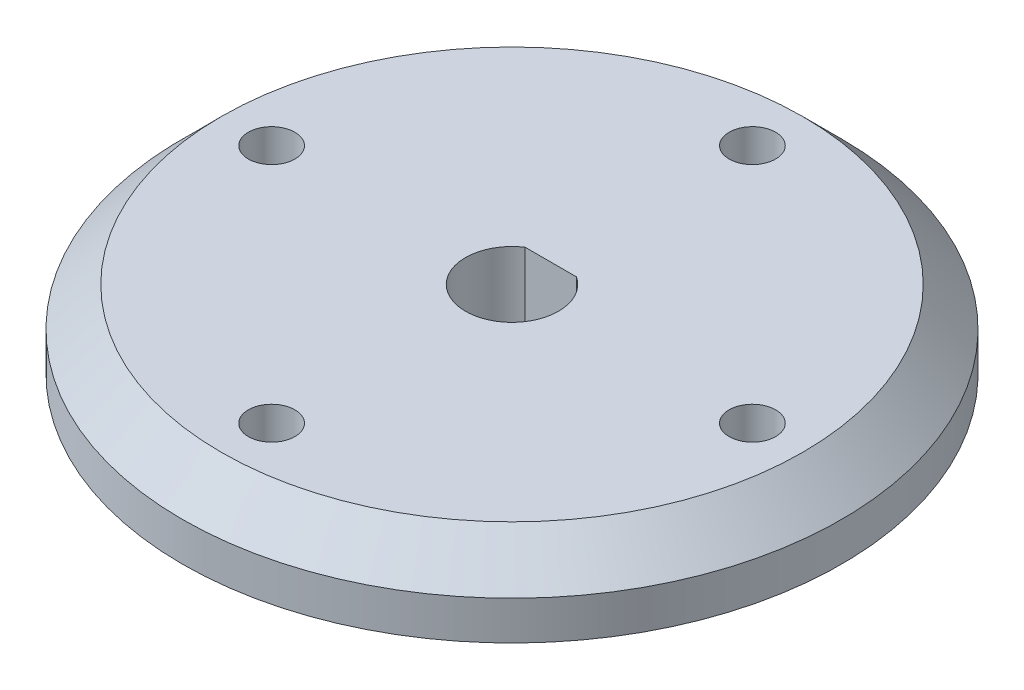
ISO-10303-21;
HEADER;
FILE_DESCRIPTION(('STEP AP214'),'2;1');
FILE_NAME('part.step','',(''),(''),'','','');
FILE_SCHEMA(('AUTOMOTIVE_DESIGN { 1 0 10303 214 1 1 1 1 }'));
ENDSEC;
DATA;
#1=APPLICATION_CONTEXT('core data for automotive mechanical design processes');
#2=APPLICATION_PROTOCOL_DEFINITION('international standard','automotive_design',2000,#1);
#3=PRODUCT_CONTEXT('',#1,'mechanical');
#4=PRODUCT('Part','Part','',(#3));
#5=PRODUCT_RELATED_PRODUCT_CATEGORY('part','',(#4));
#6=PRODUCT_DEFINITION_FORMATION('','',#4);
#7=PRODUCT_DEFINITION_CONTEXT('part definition',#1,'design');
#8=PRODUCT_DEFINITION('design','',#6,#7);
#9=PRODUCT_DEFINITION_SHAPE('','',#8);
#10=(LENGTH_UNIT() NAMED_UNIT(*) SI_UNIT(.MILLI.,.METRE.));
#11=(NAMED_UNIT(*) PLANE_ANGLE_UNIT() SI_UNIT($,.RADIAN.));
#12=(NAMED_UNIT(*) SI_UNIT($,.STERADIAN.) SOLID_ANGLE_UNIT());
#13=UNCERTAINTY_MEASURE_WITH_UNIT(LENGTH_MEASURE(1.E-05),#10,'distance_accuracy_value','');
#14=(GEOMETRIC_REPRESENTATION_CONTEXT(3) GLOBAL_UNCERTAINTY_ASSIGNED_CONTEXT((#13)) GLOBAL_UNIT_ASSIGNED_CONTEXT((#10,
#11,#12)) REPRESENTATION_CONTEXT('',''));
#15=CARTESIAN_POINT('',(0.,0.,0.));
#16=DIRECTION('',(0.,0.,1.));
#17=DIRECTION('',(1.,0.,0.));
#18=AXIS2_PLACEMENT_3D('',#15,#16,#17);
#19=CARTESIAN_POINT('',(0.,5.,0.));
#20=DIRECTION('',(0.,1.,0.));
#21=DIRECTION('',(0.,0.,1.));
#22=AXIS2_PLACEMENT_3D('',#19,#20,#21);
#23=PLANE('',#22);
#24=CARTESIAN_POINT('',(0.,5.,0.));
#25=DIRECTION('',(0.,1.,0.));
#26=DIRECTION('',(0.,0.,1.));
#27=AXIS2_PLACEMENT_3D('',#24,#25,#26);
#28=CIRCLE('',#27,18.75);
#29=CARTESIAN_POINT('',(0.,5.,-18.75));
#30=VERTEX_POINT('',#29);
#31=EDGE_CURVE('E54',#30,#30,#28,.T.);
#32=ORIENTED_EDGE('',*,*,#31,.T.);
#33=EDGE_LOOP('',(#32));
#34=FACE_BOUND('',#33,.T.);
#35=CARTESIAN_POINT('',(0.,5.,15.5));
#36=DIRECTION('',(0.,1.,0.));
#37=DIRECTION('',(0.,0.,1.));
#38=AXIS2_PLACEMENT_3D('',#35,#36,#37);
#39=CIRCLE('',#38,1.5);
#40=CARTESIAN_POINT('',(0.,5.,17.));
#41=VERTEX_POINT('',#40);
#42=EDGE_CURVE('E151',#41,#41,#39,.T.);
#43=ORIENTED_EDGE('',*,*,#42,.F.);
#44=EDGE_LOOP('',(#43));
#45=FACE_BOUND('',#44,.T.);
#46=CARTESIAN_POINT('',(0.,5.,-15.5));
#47=DIRECTION('',(0.,1.,0.));
#48=DIRECTION('',(0.,0.,1.));
#49=AXIS2_PLACEMENT_3D('',#46,#47,#48);
#50=CIRCLE('',#49,1.5);
#51=CARTESIAN_POINT('',(0.,5.,-14.));
#52=VERTEX_POINT('',#51);
#53=EDGE_CURVE('E87',#52,#52,#50,.T.);
#54=ORIENTED_EDGE('',*,*,#53,.F.);
#55=EDGE_LOOP('',(#54));
#56=FACE_BOUND('',#55,.T.);
#57=DIRECTION('',(-1.,0.,0.));
#58=VECTOR('',#57,1.);
#59=CARTESIAN_POINT('',(-1.6583123951777,5.,-2.5));
#60=LINE('',#59,#58);
#61=CARTESIAN_POINT('',(1.6583123951777,5.,-2.5));
#62=VERTEX_POINT('',#61);
#63=CARTESIAN_POINT('',(-1.6583123951777,5.,-2.5));
#64=VERTEX_POINT('',#63);
#65=EDGE_CURVE('E93',#62,#64,#60,.T.);
#66=ORIENTED_EDGE('',*,*,#65,.F.);
#67=CARTESIAN_POINT('',(0.,5.,0.));
#68=DIRECTION('',(0.,1.,0.));
#69=DIRECTION('',(0.,0.,1.));
#70=AXIS2_PLACEMENT_3D('',#67,#68,#69);
#71=CIRCLE('',#70,3.);
#72=EDGE_CURVE('E78',#64,#62,#71,.T.);
#73=ORIENTED_EDGE('',*,*,#72,.F.);
#74=EDGE_LOOP('',(#66,#73));
#75=FACE_BOUND('',#74,.T.);
#76=CARTESIAN_POINT('',(15.5,5.,0.));
#77=DIRECTION('',(0.,1.,0.));
#78=DIRECTION('',(0.,0.,1.));
#79=AXIS2_PLACEMENT_3D('',#76,#77,#78);
#80=CIRCLE('',#79,1.5);
#81=CARTESIAN_POINT('',(15.5,5.,1.5));
#82=VERTEX_POINT('',#81);
#83=EDGE_CURVE('E165',#82,#82,#80,.T.);
#84=ORIENTED_EDGE('',*,*,#83,.F.);
#85=EDGE_LOOP('',(#84));
#86=FACE_BOUND('',#85,.T.);
#87=CARTESIAN_POINT('',(-15.5,5.,0.));
#88=DIRECTION('',(0.,1.,0.));
#89=DIRECTION('',(0.,0.,1.));
#90=AXIS2_PLACEMENT_3D('',#87,#88,#89);
#91=CIRCLE('',#90,1.5);
#92=CARTESIAN_POINT('',(-15.5,5.,1.5));
#93=VERTEX_POINT('',#92);
#94=EDGE_CURVE('E156',#93,#93,#91,.T.);
#95=ORIENTED_EDGE('',*,*,#94,.F.);
#96=EDGE_LOOP('',(#95));
#97=FACE_BOUND('',#96,.T.);
#98=ADVANCED_FACE('F45',(#34,#45,#56,#75,#86,#97),#23,.T.);
#99=CARTESIAN_POINT('',(0.,0.,0.));
#100=DIRECTION('',(0.,1.,0.));
#101=DIRECTION('',(0.,0.,1.));
#102=AXIS2_PLACEMENT_3D('',#99,#100,#101);
#103=PLANE('',#102);
#104=CARTESIAN_POINT('',(0.,0.,0.));
#105=DIRECTION('',(0.,1.,0.));
#106=DIRECTION('',(0.,0.,1.));
#107=AXIS2_PLACEMENT_3D('',#104,#105,#106);
#108=CIRCLE('',#107,21.25);
#109=CARTESIAN_POINT('',(0.,0.,21.25));
#110=VERTEX_POINT('',#109);
#111=EDGE_CURVE('E83',#110,#110,#108,.T.);
#112=ORIENTED_EDGE('',*,*,#111,.F.);
#113=EDGE_LOOP('',(#112));
#114=FACE_BOUND('',#113,.T.);
#115=CARTESIAN_POINT('',(0.,0.,0.));
#116=DIRECTION('',(0.,1.,0.));
#117=DIRECTION('',(0.,0.,1.));
#118=AXIS2_PLACEMENT_3D('',#115,#116,#117);
#119=CIRCLE('',#118,3.);
#120=CARTESIAN_POINT('',(-1.6583123951777,0.,-2.5));
#121=VERTEX_POINT('',#120);
#122=CARTESIAN_POINT('',(1.6583123951777,0.,-2.5));
#123=VERTEX_POINT('',#122);
#124=EDGE_CURVE('E68',#121,#123,#119,.T.);
#125=ORIENTED_EDGE('',*,*,#124,.T.);
#126=DIRECTION('',(-1.,0.,0.));
#127=VECTOR('',#126,1.);
#128=CARTESIAN_POINT('',(-1.6583123951777,0.,-2.5));
#129=LINE('',#128,#127);
#130=EDGE_CURVE('E74',#123,#121,#129,.T.);
#131=ORIENTED_EDGE('',*,*,#130,.T.);
#132=EDGE_LOOP('',(#125,#131));
#133=FACE_BOUND('',#132,.T.);
#134=CARTESIAN_POINT('',(0.,0.,-15.5));
#135=DIRECTION('',(0.,1.,0.));
#136=DIRECTION('',(0.,0.,1.));
#137=AXIS2_PLACEMENT_3D('',#134,#135,#136);
#138=CIRCLE('',#137,1.5);
#139=CARTESIAN_POINT('',(0.,0.,-14.));
#140=VERTEX_POINT('',#139);
#141=EDGE_CURVE('E90',#140,#140,#138,.T.);
#142=ORIENTED_EDGE('',*,*,#141,.T.);
#143=EDGE_LOOP('',(#142));
#144=FACE_BOUND('',#143,.T.);
#145=CARTESIAN_POINT('',(15.5,0.,0.));
#146=DIRECTION('',(0.,1.,0.));
#147=DIRECTION('',(0.,0.,1.));
#148=AXIS2_PLACEMENT_3D('',#145,#146,#147);
#149=CIRCLE('',#148,1.5);
#150=CARTESIAN_POINT('',(15.5,0.,1.5));
#151=VERTEX_POINT('',#150);
#152=EDGE_CURVE('E158',#151,#151,#149,.T.);
#153=ORIENTED_EDGE('',*,*,#152,.T.);
#154=EDGE_LOOP('',(#153));
#155=FACE_BOUND('',#154,.T.);
#156=CARTESIAN_POINT('',(0.,0.,15.5));
#157=DIRECTION('',(0.,1.,0.));
#158=DIRECTION('',(0.,0.,1.));
#159=AXIS2_PLACEMENT_3D('',#156,#157,#158);
#160=CIRCLE('',#159,1.5);
#161=CARTESIAN_POINT('',(0.,0.,17.));
#162=VERTEX_POINT('',#161);
#163=EDGE_CURVE('E154',#162,#162,#160,.T.);
#164=ORIENTED_EDGE('',*,*,#163,.T.);
#165=EDGE_LOOP('',(#164));
#166=FACE_BOUND('',#165,.T.);
#167=CARTESIAN_POINT('',(-15.5,0.,0.));
#168=DIRECTION('',(0.,1.,0.));
#169=DIRECTION('',(0.,0.,1.));
#170=AXIS2_PLACEMENT_3D('',#167,#168,#169);
#171=CIRCLE('',#170,1.5);
#172=CARTESIAN_POINT('',(-15.5,0.,1.5));
#173=VERTEX_POINT('',#172);
#174=EDGE_CURVE('E161',#173,#173,#171,.T.);
#175=ORIENTED_EDGE('',*,*,#174,.T.);
#176=EDGE_LOOP('',(#175));
#177=FACE_BOUND('',#176,.T.);
#178=ADVANCED_FACE('F85',(#114,#133,#144,#155,#166,#177),#103,.F.);
#179=CARTESIAN_POINT('',(0.,5.,0.));
#180=DIRECTION('',(0.,-1.,0.));
#181=DIRECTION('',(0.,0.,-1.));
#182=AXIS2_PLACEMENT_3D('',#179,#180,#181);
#183=CYLINDRICAL_SURFACE('',#182,21.25);
#184=CARTESIAN_POINT('',(0.,2.49999999999997,0.));
#185=DIRECTION('',(0.,1.,0.));
#186=DIRECTION('',(0.,0.,1.));
#187=AXIS2_PLACEMENT_3D('',#184,#185,#186);
#188=CIRCLE('',#187,21.25);
#189=CARTESIAN_POINT('',(0.,2.49999999999997,-21.25));
#190=VERTEX_POINT('',#189);
#191=EDGE_CURVE('E11',#190,#190,#188,.F.);
#192=ORIENTED_EDGE('',*,*,#191,.T.);
#193=EDGE_LOOP('',(#192));
#194=FACE_BOUND('',#193,.T.);
#195=ORIENTED_EDGE('',*,*,#111,.T.);
#196=EDGE_LOOP('',(#195));
#197=FACE_BOUND('',#196,.T.);
#198=ADVANCED_FACE('F119',(#194,#197),#183,.T.);
#199=CARTESIAN_POINT('',(0.,5.,0.));
#200=DIRECTION('',(0.,-1.,0.));
#201=DIRECTION('',(0.,0.,-1.));
#202=AXIS2_PLACEMENT_3D('',#199,#200,#201);
#203=CYLINDRICAL_SURFACE('',#202,3.);
#204=ORIENTED_EDGE('',*,*,#124,.F.);
#205=DIRECTION('',(0.,-1.,0.));
#206=VECTOR('',#205,1.);
#207=CARTESIAN_POINT('',(-1.6583123951777,5.,-2.5));
#208=LINE('',#207,#206);
#209=EDGE_CURVE('E76',#64,#121,#208,.T.);
#210=ORIENTED_EDGE('',*,*,#209,.F.);
#211=ORIENTED_EDGE('',*,*,#72,.T.);
#212=DIRECTION('',(0.,-1.,0.));
#213=VECTOR('',#212,1.);
#214=CARTESIAN_POINT('',(1.6583123951777,5.,-2.5));
#215=LINE('',#214,#213);
#216=EDGE_CURVE('E61',#62,#123,#215,.T.);
#217=ORIENTED_EDGE('',*,*,#216,.T.);
#218=EDGE_LOOP('',(#204,#210,#211,#217));
#219=FACE_BOUND('',#218,.T.);
#220=ADVANCED_FACE('F80',(#219),#203,.F.);
#221=CARTESIAN_POINT('',(-1.6583123951777,5.,-2.5));
#222=DIRECTION('',(0.,0.,1.));
#223=DIRECTION('',(1.,0.,0.));
#224=AXIS2_PLACEMENT_3D('',#221,#222,#223);
#225=PLANE('',#224);
#226=ORIENTED_EDGE('',*,*,#130,.F.);
#227=ORIENTED_EDGE('',*,*,#216,.F.);
#228=ORIENTED_EDGE('',*,*,#65,.T.);
#229=ORIENTED_EDGE('',*,*,#209,.T.);
#230=EDGE_LOOP('',(#226,#227,#228,#229));
#231=FACE_BOUND('',#230,.T.);
#232=ADVANCED_FACE('F75',(#231),#225,.T.);
#233=CARTESIAN_POINT('',(0.,5.,-15.5));
#234=DIRECTION('',(0.,-1.,0.));
#235=DIRECTION('',(0.,0.,-1.));
#236=AXIS2_PLACEMENT_3D('',#233,#234,#235);
#237=CYLINDRICAL_SURFACE('',#236,1.5);
#238=ORIENTED_EDGE('',*,*,#53,.T.);
#239=EDGE_LOOP('',(#238));
#240=FACE_BOUND('',#239,.T.);
#241=ORIENTED_EDGE('',*,*,#141,.F.);
#242=EDGE_LOOP('',(#241));
#243=FACE_BOUND('',#242,.T.);
#244=ADVANCED_FACE('F133',(#240,#243),#237,.F.);
#245=CARTESIAN_POINT('',(15.5,5.,0.));
#246=DIRECTION('',(0.,-1.,0.));
#247=DIRECTION('',(0.,0.,-1.));
#248=AXIS2_PLACEMENT_3D('',#245,#246,#247);
#249=CYLINDRICAL_SURFACE('',#248,1.5);
#250=ORIENTED_EDGE('',*,*,#83,.T.);
#251=EDGE_LOOP('',(#250));
#252=FACE_BOUND('',#251,.T.);
#253=ORIENTED_EDGE('',*,*,#152,.F.);
#254=EDGE_LOOP('',(#253));
#255=FACE_BOUND('',#254,.T.);
#256=ADVANCED_FACE('F137',(#252,#255),#249,.F.);
#257=CARTESIAN_POINT('',(0.,5.,15.5));
#258=DIRECTION('',(0.,-1.,0.));
#259=DIRECTION('',(0.,0.,-1.));
#260=AXIS2_PLACEMENT_3D('',#257,#258,#259);
#261=CYLINDRICAL_SURFACE('',#260,1.5);
#262=ORIENTED_EDGE('',*,*,#42,.T.);
#263=EDGE_LOOP('',(#262));
#264=FACE_BOUND('',#263,.T.);
#265=ORIENTED_EDGE('',*,*,#163,.F.);
#266=EDGE_LOOP('',(#265));
#267=FACE_BOUND('',#266,.T.);
#268=ADVANCED_FACE('F110',(#264,#267),#261,.F.);
#269=CARTESIAN_POINT('',(-15.5,5.,0.));
#270=DIRECTION('',(0.,-1.,0.));
#271=DIRECTION('',(0.,0.,-1.));
#272=AXIS2_PLACEMENT_3D('',#269,#270,#271);
#273=CYLINDRICAL_SURFACE('',#272,1.5);
#274=ORIENTED_EDGE('',*,*,#94,.T.);
#275=EDGE_LOOP('',(#274));
#276=FACE_BOUND('',#275,.T.);
#277=ORIENTED_EDGE('',*,*,#174,.F.);
#278=EDGE_LOOP('',(#277));
#279=FACE_BOUND('',#278,.T.);
#280=ADVANCED_FACE('F104',(#276,#279),#273,.F.);
#281=CARTESIAN_POINT('',(0.,5.,0.));
#282=DIRECTION('',(0.,-1.,0.));
#283=DIRECTION('',(0.,0.,-1.));
#284=AXIS2_PLACEMENT_3D('',#281,#282,#283);
#285=CONICAL_SURFACE('',#284,18.75,0.785398163397445);
#286=CARTESIAN_POINT('',(0.,2.49999999999997,-21.25));
#287=CARTESIAN_POINT('',(0.,2.52604166666664,-21.2239583333333));
#288=CARTESIAN_POINT('',(0.,2.55208333333331,-21.1979166666667));
#289=CARTESIAN_POINT('',(0.,2.60416666666664,-21.1458333333333));
#290=CARTESIAN_POINT('',(0.,2.63020833333331,-21.1197916666667));
#291=CARTESIAN_POINT('',(0.,2.68229166666664,-21.0677083333333));
#292=CARTESIAN_POINT('',(0.,2.70833333333331,-21.0416666666667));
#293=CARTESIAN_POINT('',(0.,2.76041666666664,-20.9895833333333));
#294=CARTESIAN_POINT('',(0.,2.78645833333331,-20.9635416666667));
#295=CARTESIAN_POINT('',(0.,2.83854166666664,-20.9114583333333));
#296=CARTESIAN_POINT('',(0.,2.86458333333331,-20.8854166666667));
#297=CARTESIAN_POINT('',(0.,2.91666666666664,-20.8333333333333));
#298=CARTESIAN_POINT('',(0.,2.94270833333331,-20.8072916666667));
#299=CARTESIAN_POINT('',(0.,2.99479166666664,-20.7552083333333));
#300=CARTESIAN_POINT('',(0.,3.02083333333331,-20.7291666666667));
#301=CARTESIAN_POINT('',(0.,3.07291666666665,-20.6770833333333));
#302=CARTESIAN_POINT('',(0.,3.09895833333331,-20.6510416666667));
#303=CARTESIAN_POINT('',(0.,3.15104166666665,-20.5989583333333));
#304=CARTESIAN_POINT('',(0.,3.17708333333331,-20.5729166666667));
#305=CARTESIAN_POINT('',(0.,3.22916666666665,-20.5208333333333));
#306=CARTESIAN_POINT('',(0.,3.25520833333331,-20.4947916666667));
#307=CARTESIAN_POINT('',(0.,3.30729166666665,-20.4427083333333));
#308=CARTESIAN_POINT('',(0.,3.33333333333331,-20.4166666666667));
#309=CARTESIAN_POINT('',(0.,3.38541666666665,-20.3645833333333));
#310=CARTESIAN_POINT('',(0.,3.41145833333332,-20.3385416666667));
#311=CARTESIAN_POINT('',(0.,3.46354166666665,-20.2864583333333));
#312=CARTESIAN_POINT('',(0.,3.48958333333332,-20.2604166666667));
#313=CARTESIAN_POINT('',(0.,3.54166666666665,-20.2083333333333));
#314=CARTESIAN_POINT('',(0.,3.56770833333332,-20.1822916666667));
#315=CARTESIAN_POINT('',(0.,3.61979166666665,-20.1302083333333));
#316=CARTESIAN_POINT('',(0.,3.64583333333332,-20.1041666666667));
#317=CARTESIAN_POINT('',(0.,3.69791666666665,-20.0520833333333));
#318=CARTESIAN_POINT('',(0.,3.72395833333332,-20.0260416666667));
#319=CARTESIAN_POINT('',(0.,3.77604166666665,-19.9739583333333));
#320=CARTESIAN_POINT('',(0.,3.80208333333332,-19.9479166666667));
#321=CARTESIAN_POINT('',(0.,3.85416666666665,-19.8958333333333));
#322=CARTESIAN_POINT('',(0.,3.88020833333332,-19.8697916666667));
#323=CARTESIAN_POINT('',(0.,3.93229166666665,-19.8177083333333));
#324=CARTESIAN_POINT('',(0.,3.95833333333332,-19.7916666666667));
#325=CARTESIAN_POINT('',(0.,4.01041666666666,-19.7395833333333));
#326=CARTESIAN_POINT('',(0.,4.03645833333332,-19.7135416666667));
#327=CARTESIAN_POINT('',(0.,4.08854166666666,-19.6614583333333));
#328=CARTESIAN_POINT('',(0.,4.11458333333332,-19.6354166666667));
#329=CARTESIAN_POINT('',(0.,4.16666666666666,-19.5833333333333));
#330=CARTESIAN_POINT('',(0.,4.19270833333332,-19.5572916666667));
#331=CARTESIAN_POINT('',(0.,4.24479166666666,-19.5052083333333));
#332=CARTESIAN_POINT('',(0.,4.27083333333332,-19.4791666666667));
#333=CARTESIAN_POINT('',(0.,4.32291666666666,-19.4270833333333));
#334=CARTESIAN_POINT('',(0.,4.34895833333333,-19.4010416666667));
#335=CARTESIAN_POINT('',(0.,4.40104166666666,-19.3489583333333));
#336=CARTESIAN_POINT('',(0.,4.42708333333333,-19.3229166666667));
#337=CARTESIAN_POINT('',(0.,4.47916666666666,-19.2708333333333));
#338=CARTESIAN_POINT('',(0.,4.50520833333333,-19.2447916666667));
#339=CARTESIAN_POINT('',(0.,4.55729166666666,-19.1927083333333));
#340=CARTESIAN_POINT('',(0.,4.58333333333333,-19.1666666666667));
#341=CARTESIAN_POINT('',(0.,4.63541666666666,-19.1145833333333));
#342=CARTESIAN_POINT('',(0.,4.66145833333333,-19.0885416666667));
#343=CARTESIAN_POINT('',(0.,4.71354166666666,-19.0364583333333));
#344=CARTESIAN_POINT('',(0.,4.73958333333333,-19.0104166666667));
#345=CARTESIAN_POINT('',(0.,4.79166666666666,-18.9583333333333));
#346=CARTESIAN_POINT('',(0.,4.81770833333333,-18.9322916666667));
#347=CARTESIAN_POINT('',(0.,4.86979166666666,-18.8802083333333));
#348=CARTESIAN_POINT('',(0.,4.89583333333333,-18.8541666666667));
#349=CARTESIAN_POINT('',(0.,4.94791666666667,-18.8020833333333));
#350=CARTESIAN_POINT('',(0.,4.97395833333333,-18.7760416666667));
#351=CARTESIAN_POINT('',(0.,5.,-18.75));
#352=B_SPLINE_CURVE_WITH_KNOTS('',3,(#286,#287,#288,#289,#290,#291,#292,#293,#294,#295,#296,
#297,#298,#299,#300,#301,#302,#303,#304,#305,#306,#307,#308,#309,#310,#311,#312,#313,#314,#315,
#316,#317,#318,#319,#320,#321,#322,#323,#324,#325,#326,#327,#328,#329,#330,#331,#332,#333,#334,
#335,#336,#337,#338,#339,#340,#341,#342,#343,#344,#345,#346,#347,#348,#349,#350,#351),
.UNSPECIFIED.,.F.,.F.,(4,2,2,2,2,2,2,2,2,2,2,2,2,2,2,2,2,2,2,2,2,2,2,2,2,2,2,2,2,2,2,2,4),(0.,
0.110485434560398,0.220970869120798,0.331456303681195,0.441941738241595,0.552427172801992,
0.662912607362392,0.773398041922792,0.88388347648319,0.99436891104359,1.10485434560399,
1.21533978016439,1.32582521472478,1.43631064928518,1.54679608384558,1.65728151840598,
1.76776695296638,1.87825238752678,1.98873782208718,2.09922325664758,2.20970869120798,
2.32019412576838,2.43067956032877,2.54116499488917,2.65165042944957,2.76213586400997,
2.87262129857037,2.98310673313077,3.09359216769117,3.20407760225157,3.31456303681197,
3.42504847137236,3.53553390593276),.UNSPECIFIED.);
#353=EDGE_CURVE('BSEAM48',#190,#30,#352,.T.);
#354=ORIENTED_EDGE('',*,*,#191,.F.);
#355=ORIENTED_EDGE('',*,*,#31,.F.);
#356=ORIENTED_EDGE('',*,*,#353,.T.);
#357=ORIENTED_EDGE('',*,*,#353,.F.);
#358=EDGE_LOOP('',(#354,#356,#355,#357));
#359=FACE_BOUND('',#358,.T.);
#360=ADVANCED_FACE('F48',(#359),#285,.T.);
#361=CLOSED_SHELL('',(#98,#178,#198,#220,#232,#244,#256,#268,#280,#360));
#362=MANIFOLD_SOLID_BREP('B2',#361);
#363=ADVANCED_BREP_SHAPE_REPRESENTATION('',(#18,#362),#14);
#364=SHAPE_DEFINITION_REPRESENTATION(#9,#363);
ENDSEC;
END-ISO-10303-21;
